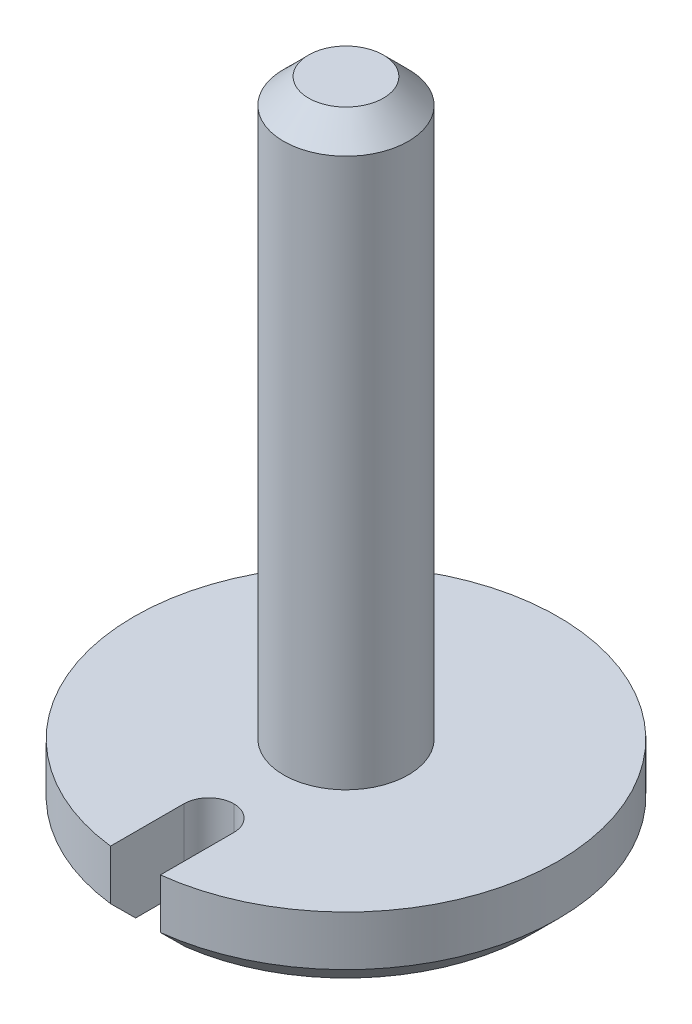
ISO-10303-21;
HEADER;
FILE_DESCRIPTION(('STEP AP214'),'2;1');
FILE_NAME('part.step','',(''),(''),'','','');
FILE_SCHEMA(('AUTOMOTIVE_DESIGN { 1 0 10303 214 1 1 1 1 }'));
ENDSEC;
DATA;
#1=APPLICATION_CONTEXT('core data for automotive mechanical design processes');
#2=APPLICATION_PROTOCOL_DEFINITION('international standard','automotive_design',2000,#1);
#3=PRODUCT_CONTEXT('',#1,'mechanical');
#4=PRODUCT('Part','Part','',(#3));
#5=PRODUCT_RELATED_PRODUCT_CATEGORY('part','',(#4));
#6=PRODUCT_DEFINITION_FORMATION('','',#4);
#7=PRODUCT_DEFINITION_CONTEXT('part definition',#1,'design');
#8=PRODUCT_DEFINITION('design','',#6,#7);
#9=PRODUCT_DEFINITION_SHAPE('','',#8);
#10=(LENGTH_UNIT() NAMED_UNIT(*) SI_UNIT(.MILLI.,.METRE.));
#11=(NAMED_UNIT(*) PLANE_ANGLE_UNIT() SI_UNIT($,.RADIAN.));
#12=(NAMED_UNIT(*) SI_UNIT($,.STERADIAN.) SOLID_ANGLE_UNIT());
#13=UNCERTAINTY_MEASURE_WITH_UNIT(LENGTH_MEASURE(1.E-05),#10,'distance_accuracy_value','');
#14=(GEOMETRIC_REPRESENTATION_CONTEXT(3) GLOBAL_UNCERTAINTY_ASSIGNED_CONTEXT((#13)) GLOBAL_UNIT_ASSIGNED_CONTEXT((#10,
#11,#12)) REPRESENTATION_CONTEXT('',''));
#15=CARTESIAN_POINT('',(0.,0.,0.));
#16=DIRECTION('',(0.,0.,1.));
#17=DIRECTION('',(1.,0.,0.));
#18=AXIS2_PLACEMENT_3D('',#15,#16,#17);
#19=CARTESIAN_POINT('',(0.,23.,0.));
#20=DIRECTION('',(0.,-1.,0.));
#21=DIRECTION('',(0.,0.,-1.));
#22=AXIS2_PLACEMENT_3D('',#19,#20,#21);
#23=CYLINDRICAL_SURFACE('',#22,2.5);
#24=CARTESIAN_POINT('',(0.,22.,0.));
#25=DIRECTION('',(0.,1.,0.));
#26=DIRECTION('',(0.,0.,1.));
#27=AXIS2_PLACEMENT_3D('',#24,#25,#26);
#28=CIRCLE('',#27,2.5);
#29=CARTESIAN_POINT('',(0.,22.,2.50000000000001));
#30=VERTEX_POINT('',#29);
#31=EDGE_CURVE('E109',#30,#30,#28,.F.);
#32=ORIENTED_EDGE('',*,*,#31,.T.);
#33=EDGE_LOOP('',(#32));
#34=FACE_BOUND('',#33,.T.);
#35=CARTESIAN_POINT('',(0.,0.,0.));
#36=DIRECTION('',(0.,1.,0.));
#37=DIRECTION('',(0.,0.,1.));
#38=AXIS2_PLACEMENT_3D('',#35,#36,#37);
#39=CIRCLE('',#38,2.5);
#40=CARTESIAN_POINT('',(0.,0.,2.5));
#41=VERTEX_POINT('',#40);
#42=EDGE_CURVE('E113',#41,#41,#39,.T.);
#43=ORIENTED_EDGE('',*,*,#42,.T.);
#44=EDGE_LOOP('',(#43));
#45=FACE_BOUND('',#44,.T.);
#46=ADVANCED_FACE('F36',(#34,#45),#23,.T.);
#47=CARTESIAN_POINT('',(0.,23.,0.));
#48=DIRECTION('',(0.,1.,0.));
#49=DIRECTION('',(0.,0.,1.));
#50=AXIS2_PLACEMENT_3D('',#47,#48,#49);
#51=PLANE('',#50);
#52=CARTESIAN_POINT('',(0.,23.,0.));
#53=DIRECTION('',(0.,1.,0.));
#54=DIRECTION('',(0.,0.,1.));
#55=AXIS2_PLACEMENT_3D('',#52,#53,#54);
#56=CIRCLE('',#55,1.49999999999999);
#57=CARTESIAN_POINT('',(0.,23.,1.5));
#58=VERTEX_POINT('',#57);
#59=EDGE_CURVE('E116',#58,#58,#56,.T.);
#60=ORIENTED_EDGE('',*,*,#59,.T.);
#61=EDGE_LOOP('',(#60));
#62=FACE_BOUND('',#61,.T.);
#63=ADVANCED_FACE('F163',(#62),#51,.T.);
#64=CARTESIAN_POINT('',(0.,23.,0.));
#65=DIRECTION('',(0.,-1.,0.));
#66=DIRECTION('',(0.,0.,-1.));
#67=AXIS2_PLACEMENT_3D('',#64,#65,#66);
#68=CONICAL_SURFACE('',#67,1.49999999999999,0.785398163397446);
#69=ORIENTED_EDGE('',*,*,#31,.F.);
#70=EDGE_LOOP('',(#69));
#71=FACE_BOUND('',#70,.T.);
#72=ORIENTED_EDGE('',*,*,#59,.F.);
#73=EDGE_LOOP('',(#72));
#74=FACE_BOUND('',#73,.T.);
#75=ADVANCED_FACE('F162',(#71,#74),#68,.T.);
#76=CARTESIAN_POINT('',(0.,-3.,0.));
#77=DIRECTION('',(0.,1.,0.));
#78=DIRECTION('',(0.,0.,1.));
#79=AXIS2_PLACEMENT_3D('',#76,#77,#78);
#80=CYLINDRICAL_SURFACE('',#79,8.5);
#81=DIRECTION('',(0.,1.,0.));
#82=VECTOR('',#81,1.);
#83=CARTESIAN_POINT('',(1.,-3.,8.44097150806709));
#84=LINE('',#83,#82);
#85=CARTESIAN_POINT('',(1.,0.,8.44097150806709));
#86=VERTEX_POINT('',#85);
#87=CARTESIAN_POINT('',(1.,-1.99999999999999,8.44097150806709));
#88=VERTEX_POINT('',#87);
#89=EDGE_CURVE('E99',#86,#88,#84,.F.);
#90=ORIENTED_EDGE('',*,*,#89,.T.);
#91=CARTESIAN_POINT('',(0.,-1.99999999999999,0.));
#92=DIRECTION('',(0.,-1.,0.));
#93=DIRECTION('',(0.,0.,-1.));
#94=AXIS2_PLACEMENT_3D('',#91,#92,#93);
#95=CIRCLE('',#94,8.5);
#96=CARTESIAN_POINT('',(-0.999999999999966,-1.99999999999999,8.44097150806709));
#97=VERTEX_POINT('',#96);
#98=EDGE_CURVE('E50',#88,#97,#95,.F.);
#99=ORIENTED_EDGE('',*,*,#98,.T.);
#100=DIRECTION('',(0.,1.,0.));
#101=VECTOR('',#100,1.);
#102=CARTESIAN_POINT('',(-0.999999999999966,-3.,8.44097150806709));
#103=LINE('',#102,#101);
#104=CARTESIAN_POINT('',(-0.999999999999966,0.,8.44097150806709));
#105=VERTEX_POINT('',#104);
#106=EDGE_CURVE('E92',#97,#105,#103,.T.);
#107=ORIENTED_EDGE('',*,*,#106,.T.);
#108=CARTESIAN_POINT('',(0.,0.,0.));
#109=DIRECTION('',(0.,-1.,0.));
#110=DIRECTION('',(0.,0.,-1.));
#111=AXIS2_PLACEMENT_3D('',#108,#109,#110);
#112=CIRCLE('',#111,8.5);
#113=EDGE_CURVE('E96',#105,#86,#112,.T.);
#114=ORIENTED_EDGE('',*,*,#113,.T.);
#115=EDGE_LOOP('',(#90,#99,#107,#114));
#116=FACE_BOUND('',#115,.T.);
#117=ADVANCED_FACE('F94',(#116),#80,.T.);
#118=CARTESIAN_POINT('',(0.,-3.,0.));
#119=DIRECTION('',(0.,-1.,0.));
#120=DIRECTION('',(0.,0.,-1.));
#121=AXIS2_PLACEMENT_3D('',#118,#119,#120);
#122=PLANE('',#121);
#123=DIRECTION('',(0.,0.,-1.));
#124=VECTOR('',#123,1.);
#125=CARTESIAN_POINT('',(-1.00000000000005,-3.,12.5));
#126=LINE('',#125,#124);
#127=CARTESIAN_POINT('',(-1.,-3.,7.43303437365928));
#128=VERTEX_POINT('',#127);
#129=CARTESIAN_POINT('',(-1.,-3.,5.50000000000003));
#130=VERTEX_POINT('',#129);
#131=EDGE_CURVE('E189',#128,#130,#126,.T.);
#132=ORIENTED_EDGE('',*,*,#131,.F.);
#133=CARTESIAN_POINT('',(0.,-3.,0.));
#134=DIRECTION('',(0.,-1.,0.));
#135=DIRECTION('',(0.,0.,-1.));
#136=AXIS2_PLACEMENT_3D('',#133,#134,#135);
#137=CIRCLE('',#136,7.5);
#138=CARTESIAN_POINT('',(1.00000000000005,-3.,7.43303437365927));
#139=VERTEX_POINT('',#138);
#140=EDGE_CURVE('E136',#128,#139,#137,.T.);
#141=ORIENTED_EDGE('',*,*,#140,.T.);
#142=DIRECTION('',(0.,0.,1.));
#143=VECTOR('',#142,1.);
#144=CARTESIAN_POINT('',(0.999999999999994,-2.99999999999999,12.5));
#145=LINE('',#144,#143);
#146=CARTESIAN_POINT('',(1.,-3.,5.50000000000001));
#147=VERTEX_POINT('',#146);
#148=EDGE_CURVE('E140',#147,#139,#145,.T.);
#149=ORIENTED_EDGE('',*,*,#148,.F.);
#150=CARTESIAN_POINT('',(0.,-3.,5.50000000000003));
#151=DIRECTION('',(0.,-1.,0.));
#152=DIRECTION('',(0.,0.,-1.));
#153=AXIS2_PLACEMENT_3D('',#150,#151,#152);
#154=CIRCLE('',#153,1.);
#155=CARTESIAN_POINT('',(0.,-3.,4.50000000000003));
#156=VERTEX_POINT('',#155);
#157=EDGE_CURVE('E132',#147,#156,#154,.F.);
#158=ORIENTED_EDGE('',*,*,#157,.T.);
#159=CARTESIAN_POINT('',(0.,-3.,5.50000000000003));
#160=DIRECTION('',(0.,-1.,0.));
#161=DIRECTION('',(0.,0.,-1.));
#162=AXIS2_PLACEMENT_3D('',#159,#160,#161);
#163=CIRCLE('',#162,1.);
#164=EDGE_CURVE('E127',#156,#130,#163,.F.);
#165=ORIENTED_EDGE('',*,*,#164,.T.);
#166=EDGE_LOOP('',(#132,#141,#149,#158,#165));
#167=FACE_BOUND('',#166,.T.);
#168=ADVANCED_FACE('F153',(#167),#122,.T.);
#169=CARTESIAN_POINT('',(0.,0.,0.));
#170=DIRECTION('',(0.,-1.,0.));
#171=DIRECTION('',(0.,0.,-1.));
#172=AXIS2_PLACEMENT_3D('',#169,#170,#171);
#173=PLANE('',#172);
#174=ORIENTED_EDGE('',*,*,#42,.F.);
#175=EDGE_LOOP('',(#174));
#176=FACE_BOUND('',#175,.T.);
#177=CARTESIAN_POINT('',(0.,0.,5.50000000000003));
#178=DIRECTION('',(0.,-1.,0.));
#179=DIRECTION('',(0.,0.,-1.));
#180=AXIS2_PLACEMENT_3D('',#177,#178,#179);
#181=CIRCLE('',#180,1.);
#182=CARTESIAN_POINT('',(-1.,0.,5.50000000000003));
#183=VERTEX_POINT('',#182);
#184=CARTESIAN_POINT('',(0.,0.,4.50000000000003));
#185=VERTEX_POINT('',#184);
#186=EDGE_CURVE('E130',#183,#185,#181,.T.);
#187=ORIENTED_EDGE('',*,*,#186,.T.);
#188=CARTESIAN_POINT('',(0.,0.,5.50000000000003));
#189=DIRECTION('',(0.,-1.,0.));
#190=DIRECTION('',(0.,0.,-1.));
#191=AXIS2_PLACEMENT_3D('',#188,#189,#190);
#192=CIRCLE('',#191,1.);
#193=CARTESIAN_POINT('',(1.,0.,5.50000000000001));
#194=VERTEX_POINT('',#193);
#195=EDGE_CURVE('E134',#185,#194,#192,.T.);
#196=ORIENTED_EDGE('',*,*,#195,.T.);
#197=DIRECTION('',(0.,0.,1.));
#198=VECTOR('',#197,1.);
#199=CARTESIAN_POINT('',(0.999999999999994,0.,12.5));
#200=LINE('',#199,#198);
#201=EDGE_CURVE('E100',#194,#86,#200,.T.);
#202=ORIENTED_EDGE('',*,*,#201,.T.);
#203=ORIENTED_EDGE('',*,*,#113,.F.);
#204=DIRECTION('',(0.,0.,-1.));
#205=VECTOR('',#204,1.);
#206=CARTESIAN_POINT('',(-0.999999999999994,0.,0.));
#207=LINE('',#206,#205);
#208=EDGE_CURVE('E104',#105,#183,#207,.T.);
#209=ORIENTED_EDGE('',*,*,#208,.T.);
#210=EDGE_LOOP('',(#187,#196,#202,#203,#209));
#211=FACE_BOUND('',#210,.T.);
#212=ADVANCED_FACE('F111',(#176,#211),#173,.F.);
#213=CARTESIAN_POINT('',(0.999999999999994,0.,12.5));
#214=DIRECTION('',(1.,0.,0.));
#215=DIRECTION('',(0.,0.,-1.));
#216=AXIS2_PLACEMENT_3D('',#213,#214,#215);
#217=PLANE('',#216);
#218=ORIENTED_EDGE('',*,*,#148,.T.);
#219=CARTESIAN_POINT('',(1.00000000000005,-3.,7.43303437365927));
#220=CARTESIAN_POINT('',(1.00000000000002,-2.83341699551649,7.60110690072669));
#221=CARTESIAN_POINT('',(1.,-2.66679215961828,7.76913792578641));
#222=CARTESIAN_POINT('',(0.999999999999987,-2.33345882628429,8.10511697058838));
#223=CARTESIAN_POINT('',(0.999999999999989,-2.16675032884917,8.27306499033126));
#224=CARTESIAN_POINT('',(1.,-1.99999999999999,8.44097150806709));
#225=B_SPLINE_CURVE_WITH_KNOTS('',3,(#219,#220,#221,#222,#223,#224),.UNSPECIFIED.,.F.,.F.,(4,2,
4),(0.,0.709918552995034,1.41983710048741),.UNSPECIFIED.);
#226=EDGE_CURVE('E64',#139,#88,#225,.T.);
#227=ORIENTED_EDGE('',*,*,#226,.T.);
#228=ORIENTED_EDGE('',*,*,#89,.F.);
#229=ORIENTED_EDGE('',*,*,#201,.F.);
#230=DIRECTION('',(0.,-1.,0.));
#231=VECTOR('',#230,1.);
#232=CARTESIAN_POINT('',(1.,-3.,5.50000000000001));
#233=LINE('',#232,#231);
#234=EDGE_CURVE('E125',#194,#147,#233,.T.);
#235=ORIENTED_EDGE('',*,*,#234,.T.);
#236=EDGE_LOOP('',(#218,#227,#228,#229,#235));
#237=FACE_BOUND('',#236,.T.);
#238=ADVANCED_FACE('F148',(#237),#217,.F.);
#239=CARTESIAN_POINT('',(-1.00000000000004,0.,12.5));
#240=DIRECTION('',(-1.,0.,0.));
#241=DIRECTION('',(0.,0.,1.));
#242=AXIS2_PLACEMENT_3D('',#239,#240,#241);
#243=PLANE('',#242);
#244=ORIENTED_EDGE('',*,*,#106,.F.);
#245=CARTESIAN_POINT('',(-0.999999999999966,-1.99999999999999,8.44097150806709));
#246=CARTESIAN_POINT('',(-1.00000000000001,-2.16675032884917,8.27306499033126));
#247=CARTESIAN_POINT('',(-1.00000000000004,-2.33345882628429,8.10511697058838));
#248=CARTESIAN_POINT('',(-1.00000000000005,-2.66679215961827,7.76913792578642));
#249=CARTESIAN_POINT('',(-1.00000000000003,-2.83341699551649,7.60110690072669));
#250=CARTESIAN_POINT('',(-1.,-3.,7.43303437365928));
#251=B_SPLINE_CURVE_WITH_KNOTS('',3,(#245,#246,#247,#248,#249,#250),.UNSPECIFIED.,.F.,.F.,(4,2,
4),(0.,0.70991854749237,1.4198371004874),.UNSPECIFIED.);
#252=EDGE_CURVE('E11',#97,#128,#251,.T.);
#253=ORIENTED_EDGE('',*,*,#252,.T.);
#254=ORIENTED_EDGE('',*,*,#131,.T.);
#255=DIRECTION('',(0.,-1.,0.));
#256=VECTOR('',#255,1.);
#257=CARTESIAN_POINT('',(-1.,0.,5.50000000000003));
#258=LINE('',#257,#256);
#259=EDGE_CURVE('E107',#130,#183,#258,.F.);
#260=ORIENTED_EDGE('',*,*,#259,.T.);
#261=ORIENTED_EDGE('',*,*,#208,.F.);
#262=EDGE_LOOP('',(#244,#253,#254,#260,#261));
#263=FACE_BOUND('',#262,.T.);
#264=ADVANCED_FACE('F105',(#263),#243,.F.);
#265=CARTESIAN_POINT('',(0.,0.,5.50000000000003));
#266=DIRECTION('',(0.,1.,0.));
#267=DIRECTION('',(0.,0.,1.));
#268=AXIS2_PLACEMENT_3D('',#265,#266,#267);
#269=CYLINDRICAL_SURFACE('',#268,1.);
#270=ORIENTED_EDGE('',*,*,#234,.F.);
#271=ORIENTED_EDGE('',*,*,#195,.F.);
#272=DIRECTION('',(0.,-1.,0.));
#273=VECTOR('',#272,1.);
#274=CARTESIAN_POINT('',(0.,0.,4.50000000000003));
#275=LINE('',#274,#273);
#276=EDGE_CURVE('E137',#156,#185,#275,.F.);
#277=ORIENTED_EDGE('',*,*,#276,.F.);
#278=ORIENTED_EDGE('',*,*,#157,.F.);
#279=EDGE_LOOP('',(#270,#271,#277,#278));
#280=FACE_BOUND('',#279,.T.);
#281=ADVANCED_FACE('F175',(#280),#269,.F.);
#282=CARTESIAN_POINT('',(0.,0.,5.50000000000003));
#283=DIRECTION('',(0.,1.,0.));
#284=DIRECTION('',(0.,0.,1.));
#285=AXIS2_PLACEMENT_3D('',#282,#283,#284);
#286=CYLINDRICAL_SURFACE('',#285,1.);
#287=ORIENTED_EDGE('',*,*,#186,.F.);
#288=ORIENTED_EDGE('',*,*,#259,.F.);
#289=ORIENTED_EDGE('',*,*,#164,.F.);
#290=ORIENTED_EDGE('',*,*,#276,.T.);
#291=EDGE_LOOP('',(#287,#288,#289,#290));
#292=FACE_BOUND('',#291,.T.);
#293=ADVANCED_FACE('F173',(#292),#286,.F.);
#294=CARTESIAN_POINT('',(0.,-3.,0.));
#295=DIRECTION('',(0.,1.,0.));
#296=DIRECTION('',(0.,0.,1.));
#297=AXIS2_PLACEMENT_3D('',#294,#295,#296);
#298=CONICAL_SURFACE('',#297,7.5,0.785398163397444);
#299=ORIENTED_EDGE('',*,*,#252,.F.);
#300=ORIENTED_EDGE('',*,*,#98,.F.);
#301=ORIENTED_EDGE('',*,*,#226,.F.);
#302=ORIENTED_EDGE('',*,*,#140,.F.);
#303=EDGE_LOOP('',(#299,#300,#301,#302));
#304=FACE_BOUND('',#303,.T.);
#305=ADVANCED_FACE('F38',(#304),#298,.T.);
#306=CLOSED_SHELL('',(#46,#63,#75,#117,#168,#212,#238,#264,#281,#293,#305));
#307=MANIFOLD_SOLID_BREP('B2',#306);
#308=ADVANCED_BREP_SHAPE_REPRESENTATION('',(#18,#307),#14);
#309=SHAPE_DEFINITION_REPRESENTATION(#9,#308);
ENDSEC;
END-ISO-10303-21;
